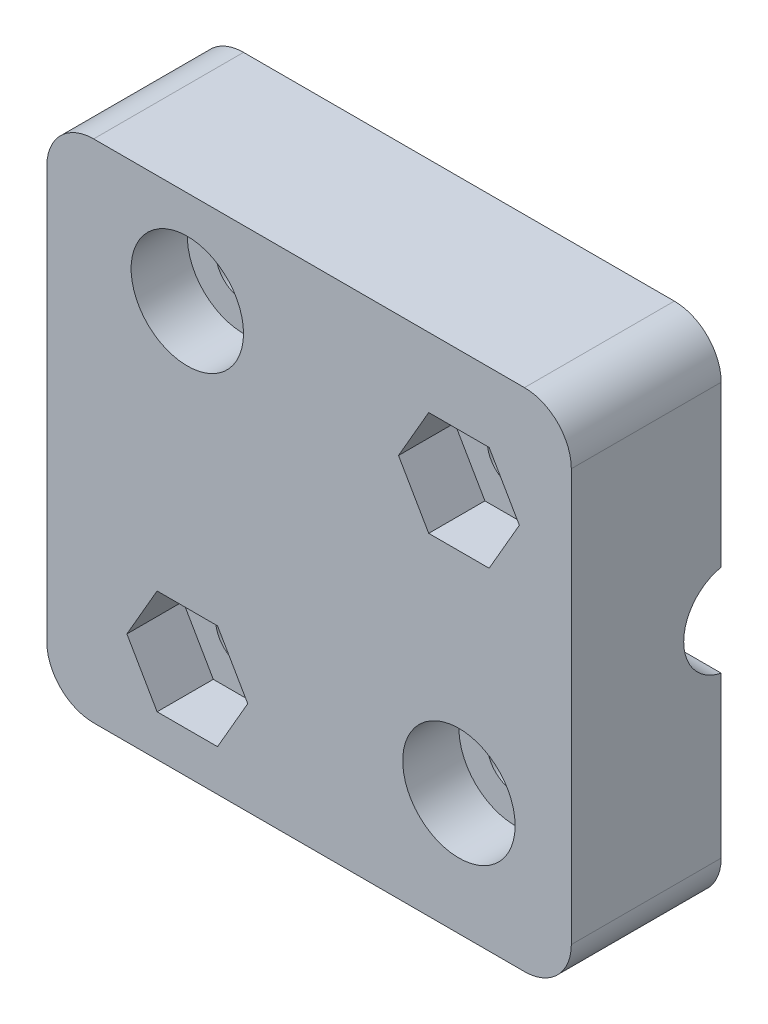
ISO-10303-21;
HEADER;
FILE_DESCRIPTION(('STEP AP214'),'2;1');
FILE_NAME('part.step','',(''),(''),'','','');
FILE_SCHEMA(('AUTOMOTIVE_DESIGN { 1 0 10303 214 1 1 1 1 }'));
ENDSEC;
DATA;
#1=APPLICATION_CONTEXT('core data for automotive mechanical design processes');
#2=APPLICATION_PROTOCOL_DEFINITION('international standard','automotive_design',2000,#1);
#3=PRODUCT_CONTEXT('',#1,'mechanical');
#4=PRODUCT('Part','Part','',(#3));
#5=PRODUCT_RELATED_PRODUCT_CATEGORY('part','',(#4));
#6=PRODUCT_DEFINITION_FORMATION('','',#4);
#7=PRODUCT_DEFINITION_CONTEXT('part definition',#1,'design');
#8=PRODUCT_DEFINITION('design','',#6,#7);
#9=PRODUCT_DEFINITION_SHAPE('','',#8);
#10=(LENGTH_UNIT() NAMED_UNIT(*) SI_UNIT(.MILLI.,.METRE.));
#11=(NAMED_UNIT(*) PLANE_ANGLE_UNIT() SI_UNIT($,.RADIAN.));
#12=(NAMED_UNIT(*) SI_UNIT($,.STERADIAN.) SOLID_ANGLE_UNIT());
#13=UNCERTAINTY_MEASURE_WITH_UNIT(LENGTH_MEASURE(1.E-05),#10,'distance_accuracy_value','');
#14=(GEOMETRIC_REPRESENTATION_CONTEXT(3) GLOBAL_UNCERTAINTY_ASSIGNED_CONTEXT((#13)) GLOBAL_UNIT_ASSIGNED_CONTEXT((#10,
#11,#12)) REPRESENTATION_CONTEXT('',''));
#15=CARTESIAN_POINT('',(0.,0.,0.));
#16=DIRECTION('',(0.,0.,1.));
#17=DIRECTION('',(1.,0.,0.));
#18=AXIS2_PLACEMENT_3D('',#15,#16,#17);
#19=CARTESIAN_POINT('',(8.,7.,0.));
#20=DIRECTION('',(0.,0.,1.));
#21=DIRECTION('',(1.,0.,0.));
#22=AXIS2_PLACEMENT_3D('',#19,#20,#21);
#23=CYLINDRICAL_SURFACE('',#22,1.48371595020286);
#24=CARTESIAN_POINT('',(8.,7.,0.));
#25=DIRECTION('',(0.,0.,1.));
#26=DIRECTION('',(1.,0.,0.));
#27=AXIS2_PLACEMENT_3D('',#24,#25,#26);
#28=CIRCLE('',#27,1.48371595020286);
#29=CARTESIAN_POINT('',(9.48371595020286,7.,0.));
#30=VERTEX_POINT('',#29);
#31=EDGE_CURVE('E235',#30,#30,#28,.T.);
#32=ORIENTED_EDGE('',*,*,#31,.F.);
#33=EDGE_LOOP('',(#32));
#34=FACE_BOUND('',#33,.T.);
#35=CARTESIAN_POINT('',(8.,7.,5.));
#36=DIRECTION('',(0.,0.,1.));
#37=DIRECTION('',(1.,0.,0.));
#38=AXIS2_PLACEMENT_3D('',#35,#36,#37);
#39=CIRCLE('',#38,1.48371595020286);
#40=CARTESIAN_POINT('',(9.48371595020286,7.,5.));
#41=VERTEX_POINT('',#40);
#42=EDGE_CURVE('E247',#41,#41,#39,.F.);
#43=ORIENTED_EDGE('',*,*,#42,.F.);
#44=EDGE_LOOP('',(#43));
#45=FACE_BOUND('',#44,.T.);
#46=ADVANCED_FACE('F32',(#34,#45),#23,.F.);
#47=CARTESIAN_POINT('',(-6.50000000000001,-8.5,0.));
#48=DIRECTION('',(0.,0.,1.));
#49=DIRECTION('',(1.,0.,0.));
#50=AXIS2_PLACEMENT_3D('',#47,#48,#49);
#51=CYLINDRICAL_SURFACE('',#50,1.48371595020286);
#52=CARTESIAN_POINT('',(-6.50000000000001,-8.5,0.));
#53=DIRECTION('',(0.,0.,1.));
#54=DIRECTION('',(1.,0.,0.));
#55=AXIS2_PLACEMENT_3D('',#52,#53,#54);
#56=CIRCLE('',#55,1.48371595020286);
#57=CARTESIAN_POINT('',(-5.01628404979715,-8.5,0.));
#58=VERTEX_POINT('',#57);
#59=EDGE_CURVE('E216',#58,#58,#56,.T.);
#60=ORIENTED_EDGE('',*,*,#59,.F.);
#61=EDGE_LOOP('',(#60));
#62=FACE_BOUND('',#61,.T.);
#63=CARTESIAN_POINT('',(-6.50000000000001,-8.5,5.));
#64=DIRECTION('',(0.,0.,1.));
#65=DIRECTION('',(1.,0.,0.));
#66=AXIS2_PLACEMENT_3D('',#63,#64,#65);
#67=CIRCLE('',#66,1.48371595020286);
#68=CARTESIAN_POINT('',(-5.01628404979715,-8.5,5.));
#69=VERTEX_POINT('',#68);
#70=EDGE_CURVE('E242',#69,#69,#67,.F.);
#71=ORIENTED_EDGE('',*,*,#70,.F.);
#72=EDGE_LOOP('',(#71));
#73=FACE_BOUND('',#72,.T.);
#74=ADVANCED_FACE('F304',(#62,#73),#51,.F.);
#75=CARTESIAN_POINT('',(8.,-7.,0.));
#76=DIRECTION('',(0.,0.,1.));
#77=DIRECTION('',(1.,0.,0.));
#78=AXIS2_PLACEMENT_3D('',#75,#76,#77);
#79=CYLINDRICAL_SURFACE('',#78,1.48371595020286);
#80=CARTESIAN_POINT('',(8.,-7.,0.));
#81=DIRECTION('',(0.,0.,1.));
#82=DIRECTION('',(1.,0.,0.));
#83=AXIS2_PLACEMENT_3D('',#80,#81,#82);
#84=CIRCLE('',#83,1.48371595020286);
#85=CARTESIAN_POINT('',(9.48371595020286,-7.,0.));
#86=VERTEX_POINT('',#85);
#87=EDGE_CURVE('E380',#86,#86,#84,.T.);
#88=ORIENTED_EDGE('',*,*,#87,.F.);
#89=EDGE_LOOP('',(#88));
#90=FACE_BOUND('',#89,.T.);
#91=CARTESIAN_POINT('',(8.,-7.,5.));
#92=DIRECTION('',(0.,0.,1.));
#93=DIRECTION('',(1.,0.,0.));
#94=AXIS2_PLACEMENT_3D('',#91,#92,#93);
#95=CIRCLE('',#94,1.48371595020286);
#96=CARTESIAN_POINT('',(9.48371595020286,-7.,5.));
#97=VERTEX_POINT('',#96);
#98=EDGE_CURVE('E237',#97,#97,#95,.F.);
#99=ORIENTED_EDGE('',*,*,#98,.F.);
#100=EDGE_LOOP('',(#99));
#101=FACE_BOUND('',#100,.T.);
#102=ADVANCED_FACE('F310',(#90,#101),#79,.F.);
#103=CARTESIAN_POINT('',(-6.50000000000001,8.5,0.));
#104=DIRECTION('',(0.,0.,1.));
#105=DIRECTION('',(1.,0.,0.));
#106=AXIS2_PLACEMENT_3D('',#103,#104,#105);
#107=CYLINDRICAL_SURFACE('',#106,1.48371595020286);
#108=CARTESIAN_POINT('',(-6.50000000000001,8.5,0.));
#109=DIRECTION('',(0.,0.,1.));
#110=DIRECTION('',(1.,0.,0.));
#111=AXIS2_PLACEMENT_3D('',#108,#109,#110);
#112=CIRCLE('',#111,1.48371595020286);
#113=CARTESIAN_POINT('',(-5.01628404979715,8.5,0.));
#114=VERTEX_POINT('',#113);
#115=EDGE_CURVE('E212',#114,#114,#112,.T.);
#116=ORIENTED_EDGE('',*,*,#115,.F.);
#117=EDGE_LOOP('',(#116));
#118=FACE_BOUND('',#117,.T.);
#119=CARTESIAN_POINT('',(-6.50000000000001,8.5,5.));
#120=DIRECTION('',(0.,0.,1.));
#121=DIRECTION('',(1.,0.,0.));
#122=AXIS2_PLACEMENT_3D('',#119,#120,#121);
#123=CIRCLE('',#122,1.48371595020286);
#124=CARTESIAN_POINT('',(-5.01628404979715,8.5,5.));
#125=VERTEX_POINT('',#124);
#126=EDGE_CURVE('E232',#125,#125,#123,.F.);
#127=ORIENTED_EDGE('',*,*,#126,.F.);
#128=EDGE_LOOP('',(#127));
#129=FACE_BOUND('',#128,.T.);
#130=ADVANCED_FACE('F320',(#118,#129),#107,.F.);
#131=CARTESIAN_POINT('',(-14.,13.5,8.));
#132=DIRECTION('',(1.,0.,0.));
#133=DIRECTION('',(0.,1.,0.));
#134=AXIS2_PLACEMENT_3D('',#131,#132,#133);
#135=PLANE('',#134);
#136=DIRECTION('',(0.,-1.,0.));
#137=VECTOR('',#136,1.);
#138=CARTESIAN_POINT('',(-14.,13.5,0.));
#139=LINE('',#138,#137);
#140=CARTESIAN_POINT('',(-14.,11.,0.));
#141=VERTEX_POINT('',#140);
#142=CARTESIAN_POINT('',(-14.,3.96862696659688,0.));
#143=VERTEX_POINT('',#142);
#144=EDGE_CURVE('E205',#141,#143,#139,.T.);
#145=ORIENTED_EDGE('',*,*,#144,.T.);
#146=CARTESIAN_POINT('',(-14.,0.,-0.5));
#147=DIRECTION('',(-1.,0.,0.));
#148=DIRECTION('',(0.,-1.,0.));
#149=AXIS2_PLACEMENT_3D('',#146,#147,#148);
#150=CIRCLE('',#149,4.);
#151=CARTESIAN_POINT('',(-14.,-3.96862696659689,0.));
#152=VERTEX_POINT('',#151);
#153=EDGE_CURVE('E193',#152,#143,#150,.T.);
#154=ORIENTED_EDGE('',*,*,#153,.F.);
#155=CARTESIAN_POINT('',(-14.,-11.,0.));
#156=VERTEX_POINT('',#155);
#157=EDGE_CURVE('E201',#152,#156,#139,.T.);
#158=ORIENTED_EDGE('',*,*,#157,.T.);
#159=DIRECTION('',(0.,0.,-1.));
#160=VECTOR('',#159,1.);
#161=CARTESIAN_POINT('',(-14.,-11.,8.));
#162=LINE('',#161,#160);
#163=CARTESIAN_POINT('',(-14.,-11.,8.));
#164=VERTEX_POINT('',#163);
#165=EDGE_CURVE('E285',#156,#164,#162,.F.);
#166=ORIENTED_EDGE('',*,*,#165,.T.);
#167=DIRECTION('',(0.,-1.,0.));
#168=VECTOR('',#167,1.);
#169=CARTESIAN_POINT('',(-14.,13.5,8.));
#170=LINE('',#169,#168);
#171=CARTESIAN_POINT('',(-14.,11.,8.));
#172=VERTEX_POINT('',#171);
#173=EDGE_CURVE('E231',#172,#164,#170,.T.);
#174=ORIENTED_EDGE('',*,*,#173,.F.);
#175=DIRECTION('',(0.,0.,-1.));
#176=VECTOR('',#175,1.);
#177=CARTESIAN_POINT('',(-14.,11.,8.));
#178=LINE('',#177,#176);
#179=EDGE_CURVE('E283',#172,#141,#178,.T.);
#180=ORIENTED_EDGE('',*,*,#179,.T.);
#181=EDGE_LOOP('',(#145,#154,#158,#166,#174,#180));
#182=FACE_BOUND('',#181,.T.);
#183=ADVANCED_FACE('F200',(#182),#135,.F.);
#184=CARTESIAN_POINT('',(14.,-13.5,8.));
#185=DIRECTION('',(0.,1.,0.));
#186=DIRECTION('',(-1.,0.,0.));
#187=AXIS2_PLACEMENT_3D('',#184,#185,#186);
#188=PLANE('',#187);
#189=DIRECTION('',(1.,0.,0.));
#190=VECTOR('',#189,1.);
#191=CARTESIAN_POINT('',(14.,-13.5,0.));
#192=LINE('',#191,#190);
#193=CARTESIAN_POINT('',(-11.5,-13.5,0.));
#194=VERTEX_POINT('',#193);
#195=CARTESIAN_POINT('',(11.5,-13.5,0.));
#196=VERTEX_POINT('',#195);
#197=EDGE_CURVE('E214',#194,#196,#192,.T.);
#198=ORIENTED_EDGE('',*,*,#197,.T.);
#199=DIRECTION('',(0.,0.,-1.));
#200=VECTOR('',#199,1.);
#201=CARTESIAN_POINT('',(11.5,-13.5,8.));
#202=LINE('',#201,#200);
#203=CARTESIAN_POINT('',(11.5,-13.5,8.));
#204=VERTEX_POINT('',#203);
#205=EDGE_CURVE('E281',#196,#204,#202,.F.);
#206=ORIENTED_EDGE('',*,*,#205,.T.);
#207=DIRECTION('',(1.,0.,0.));
#208=VECTOR('',#207,1.);
#209=CARTESIAN_POINT('',(14.,-13.5,8.));
#210=LINE('',#209,#208);
#211=CARTESIAN_POINT('',(-11.5,-13.5,8.));
#212=VERTEX_POINT('',#211);
#213=EDGE_CURVE('E370',#212,#204,#210,.T.);
#214=ORIENTED_EDGE('',*,*,#213,.F.);
#215=DIRECTION('',(0.,0.,-1.));
#216=VECTOR('',#215,1.);
#217=CARTESIAN_POINT('',(-11.5,-13.5,8.));
#218=LINE('',#217,#216);
#219=EDGE_CURVE('E278',#212,#194,#218,.T.);
#220=ORIENTED_EDGE('',*,*,#219,.T.);
#221=EDGE_LOOP('',(#198,#206,#214,#220));
#222=FACE_BOUND('',#221,.T.);
#223=ADVANCED_FACE('F340',(#222),#188,.F.);
#224=CARTESIAN_POINT('',(14.,13.5,8.));
#225=DIRECTION('',(-1.,0.,0.));
#226=DIRECTION('',(0.,-1.,0.));
#227=AXIS2_PLACEMENT_3D('',#224,#225,#226);
#228=PLANE('',#227);
#229=DIRECTION('',(0.,1.,0.));
#230=VECTOR('',#229,1.);
#231=CARTESIAN_POINT('',(14.,13.5,0.));
#232=LINE('',#231,#230);
#233=CARTESIAN_POINT('',(14.,-11.,0.));
#234=VERTEX_POINT('',#233);
#235=CARTESIAN_POINT('',(14.,-2.44948974278318,0.));
#236=VERTEX_POINT('',#235);
#237=EDGE_CURVE('E225',#234,#236,#232,.T.);
#238=ORIENTED_EDGE('',*,*,#237,.T.);
#239=CARTESIAN_POINT('',(14.,0.,-0.5));
#240=DIRECTION('',(1.,0.,0.));
#241=DIRECTION('',(0.,1.,0.));
#242=AXIS2_PLACEMENT_3D('',#239,#240,#241);
#243=CIRCLE('',#242,2.5);
#244=CARTESIAN_POINT('',(14.,2.44948974278318,0.));
#245=VERTEX_POINT('',#244);
#246=EDGE_CURVE('E486',#245,#236,#243,.T.);
#247=ORIENTED_EDGE('',*,*,#246,.F.);
#248=CARTESIAN_POINT('',(14.,11.,0.));
#249=VERTEX_POINT('',#248);
#250=EDGE_CURVE('E224',#245,#249,#232,.T.);
#251=ORIENTED_EDGE('',*,*,#250,.T.);
#252=DIRECTION('',(0.,0.,-1.));
#253=VECTOR('',#252,1.);
#254=CARTESIAN_POINT('',(14.,11.,8.));
#255=LINE('',#254,#253);
#256=CARTESIAN_POINT('',(14.,11.,8.));
#257=VERTEX_POINT('',#256);
#258=EDGE_CURVE('E268',#249,#257,#255,.F.);
#259=ORIENTED_EDGE('',*,*,#258,.T.);
#260=DIRECTION('',(0.,1.,0.));
#261=VECTOR('',#260,1.);
#262=CARTESIAN_POINT('',(14.,13.5,8.));
#263=LINE('',#262,#261);
#264=CARTESIAN_POINT('',(14.,-11.,8.));
#265=VERTEX_POINT('',#264);
#266=EDGE_CURVE('E374',#265,#257,#263,.T.);
#267=ORIENTED_EDGE('',*,*,#266,.F.);
#268=DIRECTION('',(0.,0.,-1.));
#269=VECTOR('',#268,1.);
#270=CARTESIAN_POINT('',(14.,-11.,8.));
#271=LINE('',#270,#269);
#272=EDGE_CURVE('E265',#265,#234,#271,.T.);
#273=ORIENTED_EDGE('',*,*,#272,.T.);
#274=EDGE_LOOP('',(#238,#247,#251,#259,#267,#273));
#275=FACE_BOUND('',#274,.T.);
#276=ADVANCED_FACE('F336',(#275),#228,.F.);
#277=CARTESIAN_POINT('',(14.,13.5,8.));
#278=DIRECTION('',(0.,-1.,0.));
#279=DIRECTION('',(1.,0.,0.));
#280=AXIS2_PLACEMENT_3D('',#277,#278,#279);
#281=PLANE('',#280);
#282=DIRECTION('',(-1.,0.,0.));
#283=VECTOR('',#282,1.);
#284=CARTESIAN_POINT('',(14.,13.5,8.));
#285=LINE('',#284,#283);
#286=CARTESIAN_POINT('',(11.5,13.5,8.));
#287=VERTEX_POINT('',#286);
#288=CARTESIAN_POINT('',(-11.5,13.5,8.));
#289=VERTEX_POINT('',#288);
#290=EDGE_CURVE('E220',#287,#289,#285,.T.);
#291=ORIENTED_EDGE('',*,*,#290,.F.);
#292=DIRECTION('',(0.,0.,-1.));
#293=VECTOR('',#292,1.);
#294=CARTESIAN_POINT('',(11.5,13.5,8.));
#295=LINE('',#294,#293);
#296=CARTESIAN_POINT('',(11.5,13.5,0.));
#297=VERTEX_POINT('',#296);
#298=EDGE_CURVE('E254',#287,#297,#295,.T.);
#299=ORIENTED_EDGE('',*,*,#298,.T.);
#300=DIRECTION('',(-1.,0.,0.));
#301=VECTOR('',#300,1.);
#302=CARTESIAN_POINT('',(14.,13.5,0.));
#303=LINE('',#302,#301);
#304=CARTESIAN_POINT('',(-11.5,13.5,0.));
#305=VERTEX_POINT('',#304);
#306=EDGE_CURVE('E228',#297,#305,#303,.T.);
#307=ORIENTED_EDGE('',*,*,#306,.T.);
#308=DIRECTION('',(0.,0.,-1.));
#309=VECTOR('',#308,1.);
#310=CARTESIAN_POINT('',(-11.5,13.5,8.));
#311=LINE('',#310,#309);
#312=EDGE_CURVE('E252',#305,#289,#311,.F.);
#313=ORIENTED_EDGE('',*,*,#312,.T.);
#314=EDGE_LOOP('',(#291,#299,#307,#313));
#315=FACE_BOUND('',#314,.T.);
#316=ADVANCED_FACE('F329',(#315),#281,.F.);
#317=CARTESIAN_POINT('',(0.,0.,8.));
#318=DIRECTION('',(0.,0.,-1.));
#319=DIRECTION('',(-1.,0.,0.));
#320=AXIS2_PLACEMENT_3D('',#317,#318,#319);
#321=PLANE('',#320);
#322=DIRECTION('',(1.,0.,0.));
#323=VECTOR('',#322,1.);
#324=CARTESIAN_POINT('',(6.38728749307262,4.2067,8.));
#325=LINE('',#324,#323);
#326=CARTESIAN_POINT('',(6.38728749307262,4.2067,8.));
#327=VERTEX_POINT('',#326);
#328=CARTESIAN_POINT('',(9.61271250692738,4.2067,8.));
#329=VERTEX_POINT('',#328);
#330=EDGE_CURVE('E465',#327,#329,#325,.T.);
#331=ORIENTED_EDGE('',*,*,#330,.F.);
#332=DIRECTION('',(0.5,-0.866025403784439,0.));
#333=VECTOR('',#332,1.);
#334=CARTESIAN_POINT('',(4.77457498614523,7.,8.));
#335=LINE('',#334,#333);
#336=CARTESIAN_POINT('',(4.77457498614523,7.,8.));
#337=VERTEX_POINT('',#336);
#338=EDGE_CURVE('E468',#337,#327,#335,.T.);
#339=ORIENTED_EDGE('',*,*,#338,.F.);
#340=DIRECTION('',(-0.5,-0.866025403784439,0.));
#341=VECTOR('',#340,1.);
#342=CARTESIAN_POINT('',(6.38728749307261,9.7933,8.));
#343=LINE('',#342,#341);
#344=CARTESIAN_POINT('',(6.38728749307261,9.7933,8.));
#345=VERTEX_POINT('',#344);
#346=EDGE_CURVE('E452',#345,#337,#343,.T.);
#347=ORIENTED_EDGE('',*,*,#346,.F.);
#348=DIRECTION('',(-1.,0.,0.));
#349=VECTOR('',#348,1.);
#350=CARTESIAN_POINT('',(9.61271250692738,9.7933,8.));
#351=LINE('',#350,#349);
#352=CARTESIAN_POINT('',(9.61271250692738,9.7933,8.));
#353=VERTEX_POINT('',#352);
#354=EDGE_CURVE('E456',#353,#345,#351,.T.);
#355=ORIENTED_EDGE('',*,*,#354,.F.);
#356=DIRECTION('',(-0.5,0.866025403784439,0.));
#357=VECTOR('',#356,1.);
#358=CARTESIAN_POINT('',(11.2254250138548,7.,8.));
#359=LINE('',#358,#357);
#360=CARTESIAN_POINT('',(11.2254250138548,7.,8.));
#361=VERTEX_POINT('',#360);
#362=EDGE_CURVE('E459',#361,#353,#359,.T.);
#363=ORIENTED_EDGE('',*,*,#362,.F.);
#364=DIRECTION('',(0.5,0.866025403784439,0.));
#365=VECTOR('',#364,1.);
#366=CARTESIAN_POINT('',(9.61271250692738,4.2067,8.));
#367=LINE('',#366,#365);
#368=EDGE_CURVE('E462',#329,#361,#367,.T.);
#369=ORIENTED_EDGE('',*,*,#368,.F.);
#370=EDGE_LOOP('',(#331,#339,#347,#355,#363,#369));
#371=FACE_BOUND('',#370,.T.);
#372=DIRECTION('',(1.,0.,0.));
#373=VECTOR('',#372,1.);
#374=CARTESIAN_POINT('',(-8.11271250692738,-11.2933,8.));
#375=LINE('',#374,#373);
#376=CARTESIAN_POINT('',(-8.11271250692738,-11.2933,8.));
#377=VERTEX_POINT('',#376);
#378=CARTESIAN_POINT('',(-4.88728749307263,-11.2933,8.));
#379=VERTEX_POINT('',#378);
#380=EDGE_CURVE('E419',#377,#379,#375,.T.);
#381=ORIENTED_EDGE('',*,*,#380,.F.);
#382=DIRECTION('',(0.500000000000001,-0.866025403784438,0.));
#383=VECTOR('',#382,1.);
#384=CARTESIAN_POINT('',(-9.72542501385477,-8.5,8.));
#385=LINE('',#384,#383);
#386=CARTESIAN_POINT('',(-9.72542501385477,-8.5,8.));
#387=VERTEX_POINT('',#386);
#388=EDGE_CURVE('E250',#387,#377,#385,.T.);
#389=ORIENTED_EDGE('',*,*,#388,.F.);
#390=DIRECTION('',(-0.5,-0.866025403784438,0.));
#391=VECTOR('',#390,1.);
#392=CARTESIAN_POINT('',(-8.11271250692739,-5.7067,8.));
#393=LINE('',#392,#391);
#394=CARTESIAN_POINT('',(-8.11271250692739,-5.7067,8.));
#395=VERTEX_POINT('',#394);
#396=EDGE_CURVE('E406',#395,#387,#393,.T.);
#397=ORIENTED_EDGE('',*,*,#396,.F.);
#398=DIRECTION('',(-1.,0.,0.));
#399=VECTOR('',#398,1.);
#400=CARTESIAN_POINT('',(-4.88728749307262,-5.7067,8.));
#401=LINE('',#400,#399);
#402=CARTESIAN_POINT('',(-4.88728749307262,-5.7067,8.));
#403=VERTEX_POINT('',#402);
#404=EDGE_CURVE('E410',#403,#395,#401,.T.);
#405=ORIENTED_EDGE('',*,*,#404,.F.);
#406=DIRECTION('',(-0.5,0.866025403784439,0.));
#407=VECTOR('',#406,1.);
#408=CARTESIAN_POINT('',(-3.27457498614524,-8.5,8.));
#409=LINE('',#408,#407);
#410=CARTESIAN_POINT('',(-3.27457498614524,-8.5,8.));
#411=VERTEX_POINT('',#410);
#412=EDGE_CURVE('E413',#411,#403,#409,.T.);
#413=ORIENTED_EDGE('',*,*,#412,.F.);
#414=DIRECTION('',(0.5,0.866025403784439,0.));
#415=VECTOR('',#414,1.);
#416=CARTESIAN_POINT('',(-4.88728749307263,-11.2933,8.));
#417=LINE('',#416,#415);
#418=EDGE_CURVE('E416',#379,#411,#417,.T.);
#419=ORIENTED_EDGE('',*,*,#418,.F.);
#420=EDGE_LOOP('',(#381,#389,#397,#405,#413,#419));
#421=FACE_BOUND('',#420,.T.);
#422=CARTESIAN_POINT('',(8.,-7.,8.));
#423=DIRECTION('',(0.,0.,1.));
#424=DIRECTION('',(1.,0.,0.));
#425=AXIS2_PLACEMENT_3D('',#422,#423,#424);
#426=CIRCLE('',#425,3.);
#427=CARTESIAN_POINT('',(11.,-7.,8.));
#428=VERTEX_POINT('',#427);
#429=EDGE_CURVE('E245',#428,#428,#426,.T.);
#430=ORIENTED_EDGE('',*,*,#429,.F.);
#431=EDGE_LOOP('',(#430));
#432=FACE_BOUND('',#431,.T.);
#433=CARTESIAN_POINT('',(-6.50000000000001,8.5,8.));
#434=DIRECTION('',(0.,0.,1.));
#435=DIRECTION('',(1.,0.,0.));
#436=AXIS2_PLACEMENT_3D('',#433,#434,#435);
#437=CIRCLE('',#436,3.);
#438=CARTESIAN_POINT('',(-3.50000000000001,8.5,8.));
#439=VERTEX_POINT('',#438);
#440=EDGE_CURVE('E240',#439,#439,#437,.T.);
#441=ORIENTED_EDGE('',*,*,#440,.F.);
#442=EDGE_LOOP('',(#441));
#443=FACE_BOUND('',#442,.T.);
#444=ORIENTED_EDGE('',*,*,#266,.T.);
#445=CARTESIAN_POINT('',(11.5,11.,8.));
#446=DIRECTION('',(0.,0.,-1.));
#447=DIRECTION('',(-1.,0.,0.));
#448=AXIS2_PLACEMENT_3D('',#445,#446,#447);
#449=CIRCLE('',#448,2.5);
#450=EDGE_CURVE('E276',#257,#287,#449,.F.);
#451=ORIENTED_EDGE('',*,*,#450,.T.);
#452=ORIENTED_EDGE('',*,*,#290,.T.);
#453=CARTESIAN_POINT('',(-11.5,11.,8.));
#454=DIRECTION('',(0.,0.,-1.));
#455=DIRECTION('',(-1.,0.,0.));
#456=AXIS2_PLACEMENT_3D('',#453,#454,#455);
#457=CIRCLE('',#456,2.5);
#458=EDGE_CURVE('E270',#289,#172,#457,.F.);
#459=ORIENTED_EDGE('',*,*,#458,.T.);
#460=ORIENTED_EDGE('',*,*,#173,.T.);
#461=CARTESIAN_POINT('',(-11.5,-11.,8.));
#462=DIRECTION('',(0.,0.,-1.));
#463=DIRECTION('',(-1.,0.,0.));
#464=AXIS2_PLACEMENT_3D('',#461,#462,#463);
#465=CIRCLE('',#464,2.5);
#466=EDGE_CURVE('E272',#164,#212,#465,.F.);
#467=ORIENTED_EDGE('',*,*,#466,.T.);
#468=ORIENTED_EDGE('',*,*,#213,.T.);
#469=CARTESIAN_POINT('',(11.5,-11.,8.));
#470=DIRECTION('',(0.,0.,-1.));
#471=DIRECTION('',(-1.,0.,0.));
#472=AXIS2_PLACEMENT_3D('',#469,#470,#471);
#473=CIRCLE('',#472,2.5);
#474=EDGE_CURVE('E274',#204,#265,#473,.F.);
#475=ORIENTED_EDGE('',*,*,#474,.T.);
#476=EDGE_LOOP('',(#444,#451,#452,#459,#460,#467,#468,#475));
#477=FACE_BOUND('',#476,.T.);
#478=ADVANCED_FACE('F326',(#371,#421,#432,#443,#477),#321,.F.);
#479=CARTESIAN_POINT('',(0.,0.,0.));
#480=DIRECTION('',(0.,0.,-1.));
#481=DIRECTION('',(-1.,0.,0.));
#482=AXIS2_PLACEMENT_3D('',#479,#480,#481);
#483=PLANE('',#482);
#484=DIRECTION('',(-1.,0.,0.));
#485=VECTOR('',#484,1.);
#486=CARTESIAN_POINT('',(0.,-3.96862696659689,0.));
#487=LINE('',#486,#485);
#488=CARTESIAN_POINT('',(0.,-3.96862696659689,0.));
#489=VERTEX_POINT('',#488);
#490=EDGE_CURVE('E11',#489,#152,#487,.T.);
#491=ORIENTED_EDGE('',*,*,#490,.F.);
#492=DIRECTION('',(0.,1.,0.));
#493=VECTOR('',#492,1.);
#494=CARTESIAN_POINT('',(0.,0.,0.));
#495=LINE('',#494,#493);
#496=CARTESIAN_POINT('',(0.,3.96862696659689,0.));
#497=VERTEX_POINT('',#496);
#498=EDGE_CURVE('E294',#489,#497,#495,.T.);
#499=ORIENTED_EDGE('',*,*,#498,.T.);
#500=DIRECTION('',(-1.,0.,0.));
#501=VECTOR('',#500,1.);
#502=CARTESIAN_POINT('',(0.,3.96862696659689,0.));
#503=LINE('',#502,#501);
#504=EDGE_CURVE('E40',#143,#497,#503,.F.);
#505=ORIENTED_EDGE('',*,*,#504,.F.);
#506=ORIENTED_EDGE('',*,*,#144,.F.);
#507=CARTESIAN_POINT('',(-11.5,11.,0.));
#508=DIRECTION('',(0.,0.,-1.));
#509=DIRECTION('',(-1.,0.,0.));
#510=AXIS2_PLACEMENT_3D('',#507,#508,#509);
#511=CIRCLE('',#510,2.5);
#512=EDGE_CURVE('E257',#141,#305,#511,.T.);
#513=ORIENTED_EDGE('',*,*,#512,.T.);
#514=ORIENTED_EDGE('',*,*,#306,.F.);
#515=CARTESIAN_POINT('',(11.5,11.,0.));
#516=DIRECTION('',(0.,0.,-1.));
#517=DIRECTION('',(-1.,0.,0.));
#518=AXIS2_PLACEMENT_3D('',#515,#516,#517);
#519=CIRCLE('',#518,2.5);
#520=EDGE_CURVE('E262',#297,#249,#519,.T.);
#521=ORIENTED_EDGE('',*,*,#520,.T.);
#522=ORIENTED_EDGE('',*,*,#250,.F.);
#523=DIRECTION('',(1.,0.,0.));
#524=VECTOR('',#523,1.);
#525=CARTESIAN_POINT('',(2.49999999999999,2.44948974278318,0.));
#526=LINE('',#525,#524);
#527=CARTESIAN_POINT('',(2.49999999999999,2.44948974278318,0.));
#528=VERTEX_POINT('',#527);
#529=EDGE_CURVE('E292',#528,#245,#526,.T.);
#530=ORIENTED_EDGE('',*,*,#529,.F.);
#531=DIRECTION('',(0.,-1.,0.));
#532=VECTOR('',#531,1.);
#533=CARTESIAN_POINT('',(2.5,0.,0.));
#534=LINE('',#533,#532);
#535=CARTESIAN_POINT('',(2.5,-2.44948974278318,0.));
#536=VERTEX_POINT('',#535);
#537=EDGE_CURVE('E287',#528,#536,#534,.T.);
#538=ORIENTED_EDGE('',*,*,#537,.T.);
#539=DIRECTION('',(1.,0.,0.));
#540=VECTOR('',#539,1.);
#541=CARTESIAN_POINT('',(2.5,-2.44948974278318,0.));
#542=LINE('',#541,#540);
#543=EDGE_CURVE('E290',#236,#536,#542,.F.);
#544=ORIENTED_EDGE('',*,*,#543,.F.);
#545=ORIENTED_EDGE('',*,*,#237,.F.);
#546=CARTESIAN_POINT('',(11.5,-11.,0.));
#547=DIRECTION('',(0.,0.,-1.));
#548=DIRECTION('',(-1.,0.,0.));
#549=AXIS2_PLACEMENT_3D('',#546,#547,#548);
#550=CIRCLE('',#549,2.5);
#551=EDGE_CURVE('E260',#234,#196,#550,.T.);
#552=ORIENTED_EDGE('',*,*,#551,.T.);
#553=ORIENTED_EDGE('',*,*,#197,.F.);
#554=CARTESIAN_POINT('',(-11.5,-11.,0.));
#555=DIRECTION('',(0.,0.,-1.));
#556=DIRECTION('',(-1.,0.,0.));
#557=AXIS2_PLACEMENT_3D('',#554,#555,#556);
#558=CIRCLE('',#557,2.5);
#559=EDGE_CURVE('E210',#194,#156,#558,.T.);
#560=ORIENTED_EDGE('',*,*,#559,.T.);
#561=ORIENTED_EDGE('',*,*,#157,.F.);
#562=EDGE_LOOP('',(#491,#499,#505,#506,#513,#514,#521,#522,#530,#538,#544,#545,#552,#553,#560,#561));
#563=FACE_BOUND('',#562,.T.);
#564=ORIENTED_EDGE('',*,*,#31,.T.);
#565=EDGE_LOOP('',(#564));
#566=FACE_BOUND('',#565,.T.);
#567=ORIENTED_EDGE('',*,*,#87,.T.);
#568=EDGE_LOOP('',(#567));
#569=FACE_BOUND('',#568,.T.);
#570=ORIENTED_EDGE('',*,*,#59,.T.);
#571=EDGE_LOOP('',(#570));
#572=FACE_BOUND('',#571,.T.);
#573=ORIENTED_EDGE('',*,*,#115,.T.);
#574=EDGE_LOOP('',(#573));
#575=FACE_BOUND('',#574,.T.);
#576=ADVANCED_FACE('F207',(#563,#566,#569,#572,#575),#483,.T.);
#577=CARTESIAN_POINT('',(-6.50000000000001,8.5,5.));
#578=DIRECTION('',(0.,0.,1.));
#579=DIRECTION('',(1.,0.,0.));
#580=AXIS2_PLACEMENT_3D('',#577,#578,#579);
#581=PLANE('',#580);
#582=CARTESIAN_POINT('',(-6.50000000000001,8.5,5.));
#583=DIRECTION('',(0.,0.,1.));
#584=DIRECTION('',(1.,0.,0.));
#585=AXIS2_PLACEMENT_3D('',#582,#583,#584);
#586=CIRCLE('',#585,3.);
#587=CARTESIAN_POINT('',(-3.50000000000001,8.5,5.));
#588=VERTEX_POINT('',#587);
#589=EDGE_CURVE('E236',#588,#588,#586,.T.);
#590=ORIENTED_EDGE('',*,*,#589,.T.);
#591=EDGE_LOOP('',(#590));
#592=FACE_BOUND('',#591,.T.);
#593=ORIENTED_EDGE('',*,*,#126,.T.);
#594=EDGE_LOOP('',(#593));
#595=FACE_BOUND('',#594,.T.);
#596=ADVANCED_FACE('F333',(#592,#595),#581,.T.);
#597=CARTESIAN_POINT('',(-6.50000000000001,8.5,5.));
#598=DIRECTION('',(0.,0.,1.));
#599=DIRECTION('',(1.,0.,0.));
#600=AXIS2_PLACEMENT_3D('',#597,#598,#599);
#601=CYLINDRICAL_SURFACE('',#600,3.);
#602=ORIENTED_EDGE('',*,*,#589,.F.);
#603=EDGE_LOOP('',(#602));
#604=FACE_BOUND('',#603,.T.);
#605=ORIENTED_EDGE('',*,*,#440,.T.);
#606=EDGE_LOOP('',(#605));
#607=FACE_BOUND('',#606,.T.);
#608=ADVANCED_FACE('F317',(#604,#607),#601,.F.);
#609=CARTESIAN_POINT('',(8.,-7.,5.));
#610=DIRECTION('',(0.,0.,1.));
#611=DIRECTION('',(1.,0.,0.));
#612=AXIS2_PLACEMENT_3D('',#609,#610,#611);
#613=PLANE('',#612);
#614=CARTESIAN_POINT('',(8.,-7.,5.));
#615=DIRECTION('',(0.,0.,1.));
#616=DIRECTION('',(1.,0.,0.));
#617=AXIS2_PLACEMENT_3D('',#614,#615,#616);
#618=CIRCLE('',#617,3.);
#619=CARTESIAN_POINT('',(11.,-7.,5.));
#620=VERTEX_POINT('',#619);
#621=EDGE_CURVE('E241',#620,#620,#618,.T.);
#622=ORIENTED_EDGE('',*,*,#621,.T.);
#623=EDGE_LOOP('',(#622));
#624=FACE_BOUND('',#623,.T.);
#625=ORIENTED_EDGE('',*,*,#98,.T.);
#626=EDGE_LOOP('',(#625));
#627=FACE_BOUND('',#626,.T.);
#628=ADVANCED_FACE('F569',(#624,#627),#613,.T.);
#629=CARTESIAN_POINT('',(8.,-7.,5.));
#630=DIRECTION('',(0.,0.,1.));
#631=DIRECTION('',(1.,0.,0.));
#632=AXIS2_PLACEMENT_3D('',#629,#630,#631);
#633=CYLINDRICAL_SURFACE('',#632,3.);
#634=ORIENTED_EDGE('',*,*,#621,.F.);
#635=EDGE_LOOP('',(#634));
#636=FACE_BOUND('',#635,.T.);
#637=ORIENTED_EDGE('',*,*,#429,.T.);
#638=EDGE_LOOP('',(#637));
#639=FACE_BOUND('',#638,.T.);
#640=ADVANCED_FACE('F545',(#636,#639),#633,.F.);
#641=CARTESIAN_POINT('',(0.,0.,5.));
#642=DIRECTION('',(0.,0.,1.));
#643=DIRECTION('',(1.,0.,0.));
#644=AXIS2_PLACEMENT_3D('',#641,#642,#643);
#645=PLANE('',#644);
#646=DIRECTION('',(0.500000000000001,-0.866025403784438,0.));
#647=VECTOR('',#646,1.);
#648=CARTESIAN_POINT('',(-9.72542501385477,-8.5,5.));
#649=LINE('',#648,#647);
#650=CARTESIAN_POINT('',(-9.72542501385477,-8.5,5.));
#651=VERTEX_POINT('',#650);
#652=CARTESIAN_POINT('',(-8.11271250692738,-11.2933,5.));
#653=VERTEX_POINT('',#652);
#654=EDGE_CURVE('E409',#651,#653,#649,.T.);
#655=ORIENTED_EDGE('',*,*,#654,.T.);
#656=DIRECTION('',(1.,0.,0.));
#657=VECTOR('',#656,1.);
#658=CARTESIAN_POINT('',(-8.11271250692738,-11.2933,5.));
#659=LINE('',#658,#657);
#660=CARTESIAN_POINT('',(-4.88728749307263,-11.2933,5.));
#661=VERTEX_POINT('',#660);
#662=EDGE_CURVE('E434',#653,#661,#659,.T.);
#663=ORIENTED_EDGE('',*,*,#662,.T.);
#664=DIRECTION('',(0.5,0.866025403784439,0.));
#665=VECTOR('',#664,1.);
#666=CARTESIAN_POINT('',(-4.88728749307263,-11.2933,5.));
#667=LINE('',#666,#665);
#668=CARTESIAN_POINT('',(-3.27457498614524,-8.5,5.));
#669=VERTEX_POINT('',#668);
#670=EDGE_CURVE('E431',#661,#669,#667,.T.);
#671=ORIENTED_EDGE('',*,*,#670,.T.);
#672=DIRECTION('',(-0.5,0.866025403784439,0.));
#673=VECTOR('',#672,1.);
#674=CARTESIAN_POINT('',(-3.27457498614524,-8.5,5.));
#675=LINE('',#674,#673);
#676=CARTESIAN_POINT('',(-4.88728749307262,-5.7067,5.));
#677=VERTEX_POINT('',#676);
#678=EDGE_CURVE('E428',#669,#677,#675,.T.);
#679=ORIENTED_EDGE('',*,*,#678,.T.);
#680=DIRECTION('',(-1.,0.,0.));
#681=VECTOR('',#680,1.);
#682=CARTESIAN_POINT('',(-4.88728749307262,-5.7067,5.));
#683=LINE('',#682,#681);
#684=CARTESIAN_POINT('',(-8.11271250692739,-5.7067,5.));
#685=VERTEX_POINT('',#684);
#686=EDGE_CURVE('E425',#677,#685,#683,.T.);
#687=ORIENTED_EDGE('',*,*,#686,.T.);
#688=DIRECTION('',(-0.5,-0.866025403784438,0.));
#689=VECTOR('',#688,1.);
#690=CARTESIAN_POINT('',(-8.11271250692739,-5.7067,5.));
#691=LINE('',#690,#689);
#692=EDGE_CURVE('E397',#685,#651,#691,.T.);
#693=ORIENTED_EDGE('',*,*,#692,.T.);
#694=EDGE_LOOP('',(#655,#663,#671,#679,#687,#693));
#695=FACE_BOUND('',#694,.T.);
#696=ORIENTED_EDGE('',*,*,#70,.T.);
#697=EDGE_LOOP('',(#696));
#698=FACE_BOUND('',#697,.T.);
#699=ADVANCED_FACE('F541',(#695,#698),#645,.T.);
#700=CARTESIAN_POINT('',(-9.72542501385477,-8.5,5.));
#701=DIRECTION('',(-0.866025403784438,-0.500000000000001,0.));
#702=DIRECTION('',(0.500000000000001,-0.866025403784438,0.));
#703=AXIS2_PLACEMENT_3D('',#700,#701,#702);
#704=PLANE('',#703);
#705=ORIENTED_EDGE('',*,*,#388,.T.);
#706=DIRECTION('',(0.,0.,1.));
#707=VECTOR('',#706,1.);
#708=CARTESIAN_POINT('',(-8.11271250692738,-11.2933,5.));
#709=LINE('',#708,#707);
#710=EDGE_CURVE('E393',#653,#377,#709,.T.);
#711=ORIENTED_EDGE('',*,*,#710,.F.);
#712=ORIENTED_EDGE('',*,*,#654,.F.);
#713=DIRECTION('',(0.,0.,1.));
#714=VECTOR('',#713,1.);
#715=CARTESIAN_POINT('',(-9.72542501385477,-8.5,5.));
#716=LINE('',#715,#714);
#717=EDGE_CURVE('E246',#651,#387,#716,.T.);
#718=ORIENTED_EDGE('',*,*,#717,.T.);
#719=EDGE_LOOP('',(#705,#711,#712,#718));
#720=FACE_BOUND('',#719,.T.);
#721=ADVANCED_FACE('F544',(#720),#704,.F.);
#722=CARTESIAN_POINT('',(-8.11271250692739,-5.7067,5.));
#723=DIRECTION('',(-0.866025403784438,0.5,0.));
#724=DIRECTION('',(-0.5,-0.866025403784438,0.));
#725=AXIS2_PLACEMENT_3D('',#722,#723,#724);
#726=PLANE('',#725);
#727=ORIENTED_EDGE('',*,*,#396,.T.);
#728=ORIENTED_EDGE('',*,*,#717,.F.);
#729=ORIENTED_EDGE('',*,*,#692,.F.);
#730=DIRECTION('',(0.,0.,1.));
#731=VECTOR('',#730,1.);
#732=CARTESIAN_POINT('',(-8.11271250692739,-5.7067,5.));
#733=LINE('',#732,#731);
#734=EDGE_CURVE('E403',#685,#395,#733,.T.);
#735=ORIENTED_EDGE('',*,*,#734,.T.);
#736=EDGE_LOOP('',(#727,#728,#729,#735));
#737=FACE_BOUND('',#736,.T.);
#738=ADVANCED_FACE('F547',(#737),#726,.F.);
#739=CARTESIAN_POINT('',(-4.88728749307262,-5.7067,5.));
#740=DIRECTION('',(0.,1.,0.));
#741=DIRECTION('',(0.,0.,1.));
#742=AXIS2_PLACEMENT_3D('',#739,#740,#741);
#743=PLANE('',#742);
#744=ORIENTED_EDGE('',*,*,#404,.T.);
#745=ORIENTED_EDGE('',*,*,#734,.F.);
#746=ORIENTED_EDGE('',*,*,#686,.F.);
#747=DIRECTION('',(0.,0.,1.));
#748=VECTOR('',#747,1.);
#749=CARTESIAN_POINT('',(-4.88728749307262,-5.7067,5.));
#750=LINE('',#749,#748);
#751=EDGE_CURVE('E401',#677,#403,#750,.T.);
#752=ORIENTED_EDGE('',*,*,#751,.T.);
#753=EDGE_LOOP('',(#744,#745,#746,#752));
#754=FACE_BOUND('',#753,.T.);
#755=ADVANCED_FACE('F550',(#754),#743,.F.);
#756=CARTESIAN_POINT('',(-3.27457498614524,-8.5,5.));
#757=DIRECTION('',(0.866025403784439,0.5,0.));
#758=DIRECTION('',(-0.5,0.866025403784439,0.));
#759=AXIS2_PLACEMENT_3D('',#756,#757,#758);
#760=PLANE('',#759);
#761=ORIENTED_EDGE('',*,*,#412,.T.);
#762=ORIENTED_EDGE('',*,*,#751,.F.);
#763=ORIENTED_EDGE('',*,*,#678,.F.);
#764=DIRECTION('',(0.,0.,1.));
#765=VECTOR('',#764,1.);
#766=CARTESIAN_POINT('',(-3.27457498614524,-8.5,5.));
#767=LINE('',#766,#765);
#768=EDGE_CURVE('E399',#669,#411,#767,.T.);
#769=ORIENTED_EDGE('',*,*,#768,.T.);
#770=EDGE_LOOP('',(#761,#762,#763,#769));
#771=FACE_BOUND('',#770,.T.);
#772=ADVANCED_FACE('F554',(#771),#760,.F.);
#773=CARTESIAN_POINT('',(-4.88728749307263,-11.2933,5.));
#774=DIRECTION('',(0.866025403784439,-0.5,0.));
#775=DIRECTION('',(0.5,0.866025403784439,0.));
#776=AXIS2_PLACEMENT_3D('',#773,#774,#775);
#777=PLANE('',#776);
#778=ORIENTED_EDGE('',*,*,#418,.T.);
#779=ORIENTED_EDGE('',*,*,#768,.F.);
#780=ORIENTED_EDGE('',*,*,#670,.F.);
#781=DIRECTION('',(0.,0.,1.));
#782=VECTOR('',#781,1.);
#783=CARTESIAN_POINT('',(-4.88728749307263,-11.2933,5.));
#784=LINE('',#783,#782);
#785=EDGE_CURVE('E396',#661,#379,#784,.T.);
#786=ORIENTED_EDGE('',*,*,#785,.T.);
#787=EDGE_LOOP('',(#778,#779,#780,#786));
#788=FACE_BOUND('',#787,.T.);
#789=ADVANCED_FACE('F558',(#788),#777,.F.);
#790=CARTESIAN_POINT('',(-8.11271250692738,-11.2933,5.));
#791=DIRECTION('',(0.,-1.,0.));
#792=DIRECTION('',(0.,0.,-1.));
#793=AXIS2_PLACEMENT_3D('',#790,#791,#792);
#794=PLANE('',#793);
#795=ORIENTED_EDGE('',*,*,#380,.T.);
#796=ORIENTED_EDGE('',*,*,#785,.F.);
#797=ORIENTED_EDGE('',*,*,#662,.F.);
#798=ORIENTED_EDGE('',*,*,#710,.T.);
#799=EDGE_LOOP('',(#795,#796,#797,#798));
#800=FACE_BOUND('',#799,.T.);
#801=ADVANCED_FACE('F517',(#800),#794,.F.);
#802=CARTESIAN_POINT('',(0.,0.,5.));
#803=DIRECTION('',(0.,0.,1.));
#804=DIRECTION('',(1.,0.,0.));
#805=AXIS2_PLACEMENT_3D('',#802,#803,#804);
#806=PLANE('',#805);
#807=DIRECTION('',(0.5,-0.866025403784439,0.));
#808=VECTOR('',#807,1.);
#809=CARTESIAN_POINT('',(4.77457498614523,7.,5.));
#810=LINE('',#809,#808);
#811=CARTESIAN_POINT('',(4.77457498614523,7.,5.));
#812=VERTEX_POINT('',#811);
#813=CARTESIAN_POINT('',(6.38728749307262,4.2067,5.));
#814=VERTEX_POINT('',#813);
#815=EDGE_CURVE('E455',#812,#814,#810,.T.);
#816=ORIENTED_EDGE('',*,*,#815,.T.);
#817=DIRECTION('',(1.,0.,0.));
#818=VECTOR('',#817,1.);
#819=CARTESIAN_POINT('',(6.38728749307262,4.2067,5.));
#820=LINE('',#819,#818);
#821=CARTESIAN_POINT('',(9.61271250692738,4.2067,5.));
#822=VERTEX_POINT('',#821);
#823=EDGE_CURVE('E481',#814,#822,#820,.T.);
#824=ORIENTED_EDGE('',*,*,#823,.T.);
#825=DIRECTION('',(0.5,0.866025403784439,0.));
#826=VECTOR('',#825,1.);
#827=CARTESIAN_POINT('',(9.61271250692738,4.2067,5.));
#828=LINE('',#827,#826);
#829=CARTESIAN_POINT('',(11.2254250138548,7.,5.));
#830=VERTEX_POINT('',#829);
#831=EDGE_CURVE('E478',#822,#830,#828,.T.);
#832=ORIENTED_EDGE('',*,*,#831,.T.);
#833=DIRECTION('',(-0.5,0.866025403784439,0.));
#834=VECTOR('',#833,1.);
#835=CARTESIAN_POINT('',(11.2254250138548,7.,5.));
#836=LINE('',#835,#834);
#837=CARTESIAN_POINT('',(9.61271250692738,9.7933,5.));
#838=VERTEX_POINT('',#837);
#839=EDGE_CURVE('E475',#830,#838,#836,.T.);
#840=ORIENTED_EDGE('',*,*,#839,.T.);
#841=DIRECTION('',(-1.,0.,0.));
#842=VECTOR('',#841,1.);
#843=CARTESIAN_POINT('',(9.61271250692738,9.7933,5.));
#844=LINE('',#843,#842);
#845=CARTESIAN_POINT('',(6.38728749307261,9.7933,5.));
#846=VERTEX_POINT('',#845);
#847=EDGE_CURVE('E472',#838,#846,#844,.T.);
#848=ORIENTED_EDGE('',*,*,#847,.T.);
#849=DIRECTION('',(-0.5,-0.866025403784439,0.));
#850=VECTOR('',#849,1.);
#851=CARTESIAN_POINT('',(6.38728749307261,9.7933,5.));
#852=LINE('',#851,#850);
#853=EDGE_CURVE('E443',#846,#812,#852,.T.);
#854=ORIENTED_EDGE('',*,*,#853,.T.);
#855=EDGE_LOOP('',(#816,#824,#832,#840,#848,#854));
#856=FACE_BOUND('',#855,.T.);
#857=ORIENTED_EDGE('',*,*,#42,.T.);
#858=EDGE_LOOP('',(#857));
#859=FACE_BOUND('',#858,.T.);
#860=ADVANCED_FACE('F513',(#856,#859),#806,.T.);
#861=CARTESIAN_POINT('',(4.77457498614523,7.,5.));
#862=DIRECTION('',(-0.866025403784438,-0.5,0.));
#863=DIRECTION('',(0.5,-0.866025403784439,0.));
#864=AXIS2_PLACEMENT_3D('',#861,#862,#863);
#865=PLANE('',#864);
#866=ORIENTED_EDGE('',*,*,#338,.T.);
#867=DIRECTION('',(0.,0.,1.));
#868=VECTOR('',#867,1.);
#869=CARTESIAN_POINT('',(6.38728749307262,4.2067,5.));
#870=LINE('',#869,#868);
#871=EDGE_CURVE('E439',#814,#327,#870,.T.);
#872=ORIENTED_EDGE('',*,*,#871,.F.);
#873=ORIENTED_EDGE('',*,*,#815,.F.);
#874=DIRECTION('',(0.,0.,1.));
#875=VECTOR('',#874,1.);
#876=CARTESIAN_POINT('',(4.77457498614523,7.,5.));
#877=LINE('',#876,#875);
#878=EDGE_CURVE('E251',#812,#337,#877,.T.);
#879=ORIENTED_EDGE('',*,*,#878,.T.);
#880=EDGE_LOOP('',(#866,#872,#873,#879));
#881=FACE_BOUND('',#880,.T.);
#882=ADVANCED_FACE('F516',(#881),#865,.F.);
#883=CARTESIAN_POINT('',(6.38728749307261,9.7933,5.));
#884=DIRECTION('',(-0.866025403784439,0.5,0.));
#885=DIRECTION('',(-0.5,-0.866025403784439,0.));
#886=AXIS2_PLACEMENT_3D('',#883,#884,#885);
#887=PLANE('',#886);
#888=ORIENTED_EDGE('',*,*,#346,.T.);
#889=ORIENTED_EDGE('',*,*,#878,.F.);
#890=ORIENTED_EDGE('',*,*,#853,.F.);
#891=DIRECTION('',(0.,0.,1.));
#892=VECTOR('',#891,1.);
#893=CARTESIAN_POINT('',(6.38728749307261,9.7933,5.));
#894=LINE('',#893,#892);
#895=EDGE_CURVE('E449',#846,#345,#894,.T.);
#896=ORIENTED_EDGE('',*,*,#895,.T.);
#897=EDGE_LOOP('',(#888,#889,#890,#896));
#898=FACE_BOUND('',#897,.T.);
#899=ADVANCED_FACE('F519',(#898),#887,.F.);
#900=CARTESIAN_POINT('',(9.61271250692738,9.7933,5.));
#901=DIRECTION('',(0.,1.,0.));
#902=DIRECTION('',(0.,0.,1.));
#903=AXIS2_PLACEMENT_3D('',#900,#901,#902);
#904=PLANE('',#903);
#905=ORIENTED_EDGE('',*,*,#354,.T.);
#906=ORIENTED_EDGE('',*,*,#895,.F.);
#907=ORIENTED_EDGE('',*,*,#847,.F.);
#908=DIRECTION('',(0.,0.,1.));
#909=VECTOR('',#908,1.);
#910=CARTESIAN_POINT('',(9.61271250692738,9.7933,5.));
#911=LINE('',#910,#909);
#912=EDGE_CURVE('E447',#838,#353,#911,.T.);
#913=ORIENTED_EDGE('',*,*,#912,.T.);
#914=EDGE_LOOP('',(#905,#906,#907,#913));
#915=FACE_BOUND('',#914,.T.);
#916=ADVANCED_FACE('F522',(#915),#904,.F.);
#917=CARTESIAN_POINT('',(11.2254250138548,7.,5.));
#918=DIRECTION('',(0.866025403784439,0.5,0.));
#919=DIRECTION('',(-0.5,0.866025403784439,0.));
#920=AXIS2_PLACEMENT_3D('',#917,#918,#919);
#921=PLANE('',#920);
#922=ORIENTED_EDGE('',*,*,#362,.T.);
#923=ORIENTED_EDGE('',*,*,#912,.F.);
#924=ORIENTED_EDGE('',*,*,#839,.F.);
#925=DIRECTION('',(0.,0.,1.));
#926=VECTOR('',#925,1.);
#927=CARTESIAN_POINT('',(11.2254250138548,7.,5.));
#928=LINE('',#927,#926);
#929=EDGE_CURVE('E445',#830,#361,#928,.T.);
#930=ORIENTED_EDGE('',*,*,#929,.T.);
#931=EDGE_LOOP('',(#922,#923,#924,#930));
#932=FACE_BOUND('',#931,.T.);
#933=ADVANCED_FACE('F526',(#932),#921,.F.);
#934=CARTESIAN_POINT('',(9.61271250692738,4.2067,5.));
#935=DIRECTION('',(0.866025403784439,-0.5,0.));
#936=DIRECTION('',(0.5,0.866025403784439,0.));
#937=AXIS2_PLACEMENT_3D('',#934,#935,#936);
#938=PLANE('',#937);
#939=ORIENTED_EDGE('',*,*,#368,.T.);
#940=ORIENTED_EDGE('',*,*,#929,.F.);
#941=ORIENTED_EDGE('',*,*,#831,.F.);
#942=DIRECTION('',(0.,0.,1.));
#943=VECTOR('',#942,1.);
#944=CARTESIAN_POINT('',(9.61271250692738,4.2067,5.));
#945=LINE('',#944,#943);
#946=EDGE_CURVE('E442',#822,#329,#945,.T.);
#947=ORIENTED_EDGE('',*,*,#946,.T.);
#948=EDGE_LOOP('',(#939,#940,#941,#947));
#949=FACE_BOUND('',#948,.T.);
#950=ADVANCED_FACE('F530',(#949),#938,.F.);
#951=CARTESIAN_POINT('',(6.38728749307262,4.2067,5.));
#952=DIRECTION('',(0.,-1.,0.));
#953=DIRECTION('',(1.,0.,0.));
#954=AXIS2_PLACEMENT_3D('',#951,#952,#953);
#955=PLANE('',#954);
#956=ORIENTED_EDGE('',*,*,#330,.T.);
#957=ORIENTED_EDGE('',*,*,#946,.F.);
#958=ORIENTED_EDGE('',*,*,#823,.F.);
#959=ORIENTED_EDGE('',*,*,#871,.T.);
#960=EDGE_LOOP('',(#956,#957,#958,#959));
#961=FACE_BOUND('',#960,.T.);
#962=ADVANCED_FACE('F351',(#961),#955,.F.);
#963=CARTESIAN_POINT('',(11.5,11.,8.));
#964=DIRECTION('',(0.,0.,-1.));
#965=DIRECTION('',(-1.,0.,0.));
#966=AXIS2_PLACEMENT_3D('',#963,#964,#965);
#967=CYLINDRICAL_SURFACE('',#966,2.5);
#968=ORIENTED_EDGE('',*,*,#450,.F.);
#969=ORIENTED_EDGE('',*,*,#258,.F.);
#970=ORIENTED_EDGE('',*,*,#520,.F.);
#971=ORIENTED_EDGE('',*,*,#298,.F.);
#972=EDGE_LOOP('',(#968,#969,#970,#971));
#973=FACE_BOUND('',#972,.T.);
#974=ADVANCED_FACE('F347',(#973),#967,.T.);
#975=CARTESIAN_POINT('',(11.5,-11.,8.));
#976=DIRECTION('',(0.,0.,-1.));
#977=DIRECTION('',(-1.,0.,0.));
#978=AXIS2_PLACEMENT_3D('',#975,#976,#977);
#979=CYLINDRICAL_SURFACE('',#978,2.5);
#980=ORIENTED_EDGE('',*,*,#474,.F.);
#981=ORIENTED_EDGE('',*,*,#205,.F.);
#982=ORIENTED_EDGE('',*,*,#551,.F.);
#983=ORIENTED_EDGE('',*,*,#272,.F.);
#984=EDGE_LOOP('',(#980,#981,#982,#983));
#985=FACE_BOUND('',#984,.T.);
#986=ADVANCED_FACE('F350',(#985),#979,.T.);
#987=CARTESIAN_POINT('',(-11.5,-11.,8.));
#988=DIRECTION('',(0.,0.,-1.));
#989=DIRECTION('',(-1.,0.,0.));
#990=AXIS2_PLACEMENT_3D('',#987,#988,#989);
#991=CYLINDRICAL_SURFACE('',#990,2.5);
#992=ORIENTED_EDGE('',*,*,#466,.F.);
#993=ORIENTED_EDGE('',*,*,#165,.F.);
#994=ORIENTED_EDGE('',*,*,#559,.F.);
#995=ORIENTED_EDGE('',*,*,#219,.F.);
#996=EDGE_LOOP('',(#992,#993,#994,#995));
#997=FACE_BOUND('',#996,.T.);
#998=ADVANCED_FACE('F354',(#997),#991,.T.);
#999=CARTESIAN_POINT('',(-11.5,11.,8.));
#1000=DIRECTION('',(0.,0.,-1.));
#1001=DIRECTION('',(-1.,0.,0.));
#1002=AXIS2_PLACEMENT_3D('',#999,#1000,#1001);
#1003=CYLINDRICAL_SURFACE('',#1002,2.5);
#1004=ORIENTED_EDGE('',*,*,#458,.F.);
#1005=ORIENTED_EDGE('',*,*,#312,.F.);
#1006=ORIENTED_EDGE('',*,*,#512,.F.);
#1007=ORIENTED_EDGE('',*,*,#179,.F.);
#1008=EDGE_LOOP('',(#1004,#1005,#1006,#1007));
#1009=FACE_BOUND('',#1008,.T.);
#1010=ADVANCED_FACE('F34',(#1009),#1003,.T.);
#1011=CARTESIAN_POINT('',(2.5,0.,-0.5));
#1012=DIRECTION('',(1.,0.,0.));
#1013=DIRECTION('',(0.,1.,0.));
#1014=AXIS2_PLACEMENT_3D('',#1011,#1012,#1013);
#1015=CYLINDRICAL_SURFACE('',#1014,2.5);
#1016=ORIENTED_EDGE('',*,*,#529,.T.);
#1017=ORIENTED_EDGE('',*,*,#246,.T.);
#1018=ORIENTED_EDGE('',*,*,#543,.T.);
#1019=CARTESIAN_POINT('',(2.5,0.,-0.5));
#1020=DIRECTION('',(1.,0.,0.));
#1021=DIRECTION('',(0.,1.,0.));
#1022=AXIS2_PLACEMENT_3D('',#1019,#1020,#1021);
#1023=CIRCLE('',#1022,2.5);
#1024=EDGE_CURVE('E53',#528,#536,#1023,.T.);
#1025=ORIENTED_EDGE('',*,*,#1024,.F.);
#1026=EDGE_LOOP('',(#1016,#1017,#1018,#1025));
#1027=FACE_BOUND('',#1026,.T.);
#1028=ADVANCED_FACE('F361',(#1027),#1015,.F.);
#1029=CARTESIAN_POINT('',(2.5,0.,-0.5));
#1030=DIRECTION('',(1.,0.,0.));
#1031=DIRECTION('',(0.,1.,0.));
#1032=AXIS2_PLACEMENT_3D('',#1029,#1030,#1031);
#1033=PLANE('',#1032);
#1034=ORIENTED_EDGE('',*,*,#1024,.T.);
#1035=ORIENTED_EDGE('',*,*,#537,.F.);
#1036=EDGE_LOOP('',(#1034,#1035));
#1037=FACE_BOUND('',#1036,.T.);
#1038=ADVANCED_FACE('F301',(#1037),#1033,.T.);
#1039=CARTESIAN_POINT('',(0.,0.,-0.5));
#1040=DIRECTION('',(-1.,0.,0.));
#1041=DIRECTION('',(0.,-1.,0.));
#1042=AXIS2_PLACEMENT_3D('',#1039,#1040,#1041);
#1043=CYLINDRICAL_SURFACE('',#1042,4.);
#1044=ORIENTED_EDGE('',*,*,#490,.T.);
#1045=ORIENTED_EDGE('',*,*,#153,.T.);
#1046=ORIENTED_EDGE('',*,*,#504,.T.);
#1047=CARTESIAN_POINT('',(0.,0.,-0.5));
#1048=DIRECTION('',(-1.,0.,0.));
#1049=DIRECTION('',(0.,-1.,0.));
#1050=AXIS2_PLACEMENT_3D('',#1047,#1048,#1049);
#1051=CIRCLE('',#1050,4.);
#1052=EDGE_CURVE('E46',#489,#497,#1051,.T.);
#1053=ORIENTED_EDGE('',*,*,#1052,.F.);
#1054=EDGE_LOOP('',(#1044,#1045,#1046,#1053));
#1055=FACE_BOUND('',#1054,.T.);
#1056=ADVANCED_FACE('F192',(#1055),#1043,.F.);
#1057=CARTESIAN_POINT('',(0.,0.,-0.5));
#1058=DIRECTION('',(-1.,0.,0.));
#1059=DIRECTION('',(0.,-1.,0.));
#1060=AXIS2_PLACEMENT_3D('',#1057,#1058,#1059);
#1061=PLANE('',#1060);
#1062=ORIENTED_EDGE('',*,*,#1052,.T.);
#1063=ORIENTED_EDGE('',*,*,#498,.F.);
#1064=EDGE_LOOP('',(#1062,#1063));
#1065=FACE_BOUND('',#1064,.T.);
#1066=ADVANCED_FACE('F295',(#1065),#1061,.T.);
#1067=CLOSED_SHELL('',(#46,#74,#102,#130,#183,#223,#276,#316,#478,#576,#596,#608,#628,#640,#699,
#721,#738,#755,#772,#789,#801,#860,#882,#899,#916,#933,#950,#962,#974,#986,#998,#1010,#1028,
#1038,#1056,#1066));
#1068=MANIFOLD_SOLID_BREP('B2',#1067);
#1069=ADVANCED_BREP_SHAPE_REPRESENTATION('',(#18,#1068),#14);
#1070=SHAPE_DEFINITION_REPRESENTATION(#9,#1069);
ENDSEC;
END-ISO-10303-21;
